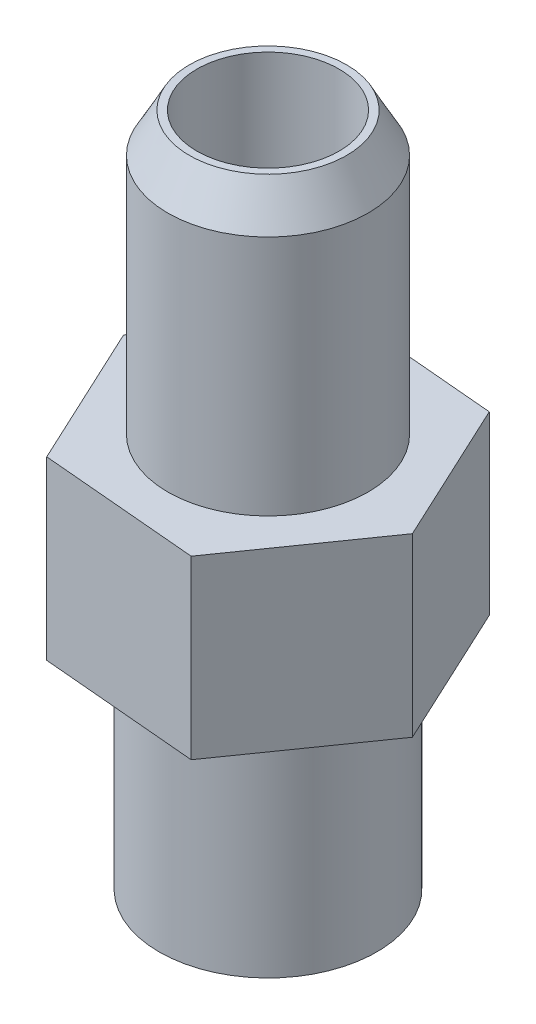
ISO-10303-21;
HEADER;
FILE_DESCRIPTION(('STEP AP214'),'2;1');
FILE_NAME('part.step','',(''),(''),'','','');
FILE_SCHEMA(('AUTOMOTIVE_DESIGN { 1 0 10303 214 1 1 1 1 }'));
ENDSEC;
DATA;
#1=APPLICATION_CONTEXT('core data for automotive mechanical design processes');
#2=APPLICATION_PROTOCOL_DEFINITION('international standard','automotive_design',2000,#1);
#3=PRODUCT_CONTEXT('',#1,'mechanical');
#4=PRODUCT('Part','Part','',(#3));
#5=PRODUCT_RELATED_PRODUCT_CATEGORY('part','',(#4));
#6=PRODUCT_DEFINITION_FORMATION('','',#4);
#7=PRODUCT_DEFINITION_CONTEXT('part definition',#1,'design');
#8=PRODUCT_DEFINITION('design','',#6,#7);
#9=PRODUCT_DEFINITION_SHAPE('','',#8);
#10=(LENGTH_UNIT() NAMED_UNIT(*) SI_UNIT(.MILLI.,.METRE.));
#11=(NAMED_UNIT(*) PLANE_ANGLE_UNIT() SI_UNIT($,.RADIAN.));
#12=(NAMED_UNIT(*) SI_UNIT($,.STERADIAN.) SOLID_ANGLE_UNIT());
#13=UNCERTAINTY_MEASURE_WITH_UNIT(LENGTH_MEASURE(1.E-05),#10,'distance_accuracy_value','');
#14=(GEOMETRIC_REPRESENTATION_CONTEXT(3) GLOBAL_UNCERTAINTY_ASSIGNED_CONTEXT((#13)) GLOBAL_UNIT_ASSIGNED_CONTEXT((#10,
#11,#12)) REPRESENTATION_CONTEXT('',''));
#15=CARTESIAN_POINT('',(0.,0.,0.));
#16=DIRECTION('',(0.,0.,1.));
#17=DIRECTION('',(1.,0.,0.));
#18=AXIS2_PLACEMENT_3D('',#15,#16,#17);
#19=CARTESIAN_POINT('',(6.3,18.1,0.));
#20=DIRECTION('',(0.,1.,0.));
#21=DIRECTION('',(0.,0.,1.));
#22=AXIS2_PLACEMENT_3D('',#19,#20,#21);
#23=PLANE('',#22);
#24=CARTESIAN_POINT('',(0.,18.1,0.));
#25=DIRECTION('',(0.,-1.,0.));
#26=DIRECTION('',(0.,0.,-1.));
#27=AXIS2_PLACEMENT_3D('',#24,#25,#26);
#28=CIRCLE('',#27,4.6);
#29=CARTESIAN_POINT('',(0.,18.1,-4.6));
#30=VERTEX_POINT('',#29);
#31=EDGE_CURVE('E142',#30,#30,#28,.T.);
#32=ORIENTED_EDGE('',*,*,#31,.T.);
#33=EDGE_LOOP('',(#32));
#34=FACE_BOUND('',#33,.T.);
#35=DIRECTION('',(0.573623240162906,0.,-0.819119269914345));
#36=VECTOR('',#35,1.);
#37=CARTESIAN_POINT('',(3.084448550397,18.1,6.61560813154883));
#38=LINE('',#37,#36);
#39=CARTESIAN_POINT('',(3.084448550397,18.1,6.61560813154883));
#40=VERTEX_POINT('',#39);
#41=CARTESIAN_POINT('',(7.27150897860269,18.1,0.63659326446452));
#42=VERTEX_POINT('',#41);
#43=EDGE_CURVE('E111',#40,#42,#38,.T.);
#44=ORIENTED_EDGE('',*,*,#43,.T.);
#45=DIRECTION('',(-0.422566476393732,0.,-0.906331933139391));
#46=VECTOR('',#45,1.);
#47=CARTESIAN_POINT('',(7.27150897860269,18.1,0.63659326446452));
#48=LINE('',#47,#46);
#49=CARTESIAN_POINT('',(4.18706042820569,18.1,-5.97901486708431));
#50=VERTEX_POINT('',#49);
#51=EDGE_CURVE('E99',#42,#50,#48,.T.);
#52=ORIENTED_EDGE('',*,*,#51,.T.);
#53=DIRECTION('',(-0.996189716556638,0.,-0.0872126632250464));
#54=VECTOR('',#53,1.);
#55=CARTESIAN_POINT('',(4.18706042820569,18.1,-5.97901486708431));
#56=LINE('',#55,#54);
#57=CARTESIAN_POINT('',(-3.084448550397,18.1,-6.61560813154883));
#58=VERTEX_POINT('',#57);
#59=EDGE_CURVE('E104',#50,#58,#56,.T.);
#60=ORIENTED_EDGE('',*,*,#59,.T.);
#61=DIRECTION('',(-0.573623240162906,0.,0.819119269914345));
#62=VECTOR('',#61,1.);
#63=CARTESIAN_POINT('',(-3.084448550397,18.1,-6.61560813154883));
#64=LINE('',#63,#62);
#65=CARTESIAN_POINT('',(-7.27150897860269,18.1,-0.636593264464522));
#66=VERTEX_POINT('',#65);
#67=EDGE_CURVE('E108',#58,#66,#64,.T.);
#68=ORIENTED_EDGE('',*,*,#67,.T.);
#69=DIRECTION('',(0.422566476393732,0.,0.906331933139391));
#70=VECTOR('',#69,1.);
#71=CARTESIAN_POINT('',(-7.27150897860269,18.1,-0.636593264464522));
#72=LINE('',#71,#70);
#73=CARTESIAN_POINT('',(-4.18706042820569,18.1,5.97901486708431));
#74=VERTEX_POINT('',#73);
#75=EDGE_CURVE('E166',#66,#74,#72,.T.);
#76=ORIENTED_EDGE('',*,*,#75,.T.);
#77=DIRECTION('',(0.996189716556638,0.,0.0872126632250462));
#78=VECTOR('',#77,1.);
#79=CARTESIAN_POINT('',(-4.18706042820569,18.1,5.97901486708431));
#80=LINE('',#79,#78);
#81=EDGE_CURVE('E117',#74,#40,#80,.T.);
#82=ORIENTED_EDGE('',*,*,#81,.T.);
#83=EDGE_LOOP('',(#44,#52,#60,#68,#76,#82));
#84=FACE_BOUND('',#83,.T.);
#85=ADVANCED_FACE('F34',(#34,#84),#23,.T.);
#86=CARTESIAN_POINT('',(0.,0.,0.));
#87=DIRECTION('',(0.,-1.,0.));
#88=DIRECTION('',(0.,0.,-1.));
#89=AXIS2_PLACEMENT_3D('',#86,#87,#88);
#90=CYLINDRICAL_SURFACE('',#89,4.6);
#91=CARTESIAN_POINT('',(0.,29.2,0.));
#92=DIRECTION('',(0.,-1.,0.));
#93=DIRECTION('',(0.,0.,-1.));
#94=AXIS2_PLACEMENT_3D('',#91,#92,#93);
#95=CIRCLE('',#94,4.6);
#96=CARTESIAN_POINT('',(0.,29.2,-4.6));
#97=VERTEX_POINT('',#96);
#98=EDGE_CURVE('E139',#97,#97,#95,.T.);
#99=ORIENTED_EDGE('',*,*,#98,.T.);
#100=EDGE_LOOP('',(#99));
#101=FACE_BOUND('',#100,.T.);
#102=ORIENTED_EDGE('',*,*,#31,.F.);
#103=EDGE_LOOP('',(#102));
#104=FACE_BOUND('',#103,.T.);
#105=ADVANCED_FACE('F187',(#101,#104),#90,.T.);
#106=CARTESIAN_POINT('',(0.,29.2,0.));
#107=DIRECTION('',(0.,-1.,0.));
#108=DIRECTION('',(0.,0.,-1.));
#109=AXIS2_PLACEMENT_3D('',#106,#107,#108);
#110=CONICAL_SURFACE('',#109,4.6,0.502341921510061);
#111=CARTESIAN_POINT('',(0.,31.,0.));
#112=DIRECTION('',(0.,-1.,0.));
#113=DIRECTION('',(0.,0.,-1.));
#114=AXIS2_PLACEMENT_3D('',#111,#112,#113);
#115=CIRCLE('',#114,3.61117494919417);
#116=CARTESIAN_POINT('',(0.,31.,-3.61117494919417));
#117=VERTEX_POINT('',#116);
#118=EDGE_CURVE('E136',#117,#117,#115,.T.);
#119=ORIENTED_EDGE('',*,*,#118,.T.);
#120=EDGE_LOOP('',(#119));
#121=FACE_BOUND('',#120,.T.);
#122=ORIENTED_EDGE('',*,*,#98,.F.);
#123=EDGE_LOOP('',(#122));
#124=FACE_BOUND('',#123,.T.);
#125=ADVANCED_FACE('F193',(#121,#124),#110,.T.);
#126=CARTESIAN_POINT('',(3.61117494919417,31.,0.));
#127=DIRECTION('',(0.,1.,0.));
#128=DIRECTION('',(0.,0.,1.));
#129=AXIS2_PLACEMENT_3D('',#126,#127,#128);
#130=PLANE('',#129);
#131=CARTESIAN_POINT('',(0.,31.,0.));
#132=DIRECTION('',(0.,1.,0.));
#133=DIRECTION('',(0.,0.,1.));
#134=AXIS2_PLACEMENT_3D('',#131,#132,#133);
#135=CIRCLE('',#134,3.26860596304638);
#136=CARTESIAN_POINT('',(0.,31.,3.26860596304638));
#137=VERTEX_POINT('',#136);
#138=EDGE_CURVE('E172',#137,#137,#135,.T.);
#139=ORIENTED_EDGE('',*,*,#138,.F.);
#140=EDGE_LOOP('',(#139));
#141=FACE_BOUND('',#140,.T.);
#142=ORIENTED_EDGE('',*,*,#118,.F.);
#143=EDGE_LOOP('',(#142));
#144=FACE_BOUND('',#143,.T.);
#145=ADVANCED_FACE('F199',(#141,#144),#130,.T.);
#146=CARTESIAN_POINT('',(7.27150897860269,-9.66124246085323,0.63659326446452));
#147=DIRECTION('',(0.906331933139391,0.,-0.422566476393732));
#148=DIRECTION('',(-0.422566476393732,0.,-0.906331933139391));
#149=AXIS2_PLACEMENT_3D('',#146,#147,#148);
#150=PLANE('',#149);
#151=DIRECTION('',(0.,1.,0.));
#152=VECTOR('',#151,1.);
#153=CARTESIAN_POINT('',(7.27150897860269,-9.66124246085323,0.63659326446452));
#154=LINE('',#153,#152);
#155=CARTESIAN_POINT('',(7.27150897860269,10.,0.63659326446452));
#156=VERTEX_POINT('',#155);
#157=EDGE_CURVE('E52',#156,#42,#154,.T.);
#158=ORIENTED_EDGE('',*,*,#157,.F.);
#159=DIRECTION('',(-0.422566476393732,0.,-0.906331933139391));
#160=VECTOR('',#159,1.);
#161=CARTESIAN_POINT('',(7.27150897860269,10.,0.63659326446452));
#162=LINE('',#161,#160);
#163=CARTESIAN_POINT('',(4.18706042820569,10.,-5.97901486708431));
#164=VERTEX_POINT('',#163);
#165=EDGE_CURVE('E101',#156,#164,#162,.T.);
#166=ORIENTED_EDGE('',*,*,#165,.T.);
#167=DIRECTION('',(0.,1.,0.));
#168=VECTOR('',#167,1.);
#169=CARTESIAN_POINT('',(4.18706042820569,-9.66124246085323,-5.97901486708431));
#170=LINE('',#169,#168);
#171=EDGE_CURVE('E96',#164,#50,#170,.T.);
#172=ORIENTED_EDGE('',*,*,#171,.T.);
#173=ORIENTED_EDGE('',*,*,#51,.F.);
#174=EDGE_LOOP('',(#158,#166,#172,#173));
#175=FACE_BOUND('',#174,.T.);
#176=ADVANCED_FACE('F97',(#175),#150,.T.);
#177=CARTESIAN_POINT('',(4.18706042820569,-9.66124246085323,-5.97901486708431));
#178=DIRECTION('',(0.0872126632250464,0.,-0.996189716556638));
#179=DIRECTION('',(-0.996189716556638,0.,-0.0872126632250464));
#180=AXIS2_PLACEMENT_3D('',#177,#178,#179);
#181=PLANE('',#180);
#182=ORIENTED_EDGE('',*,*,#171,.F.);
#183=DIRECTION('',(-0.996189716556638,0.,-0.0872126632250464));
#184=VECTOR('',#183,1.);
#185=CARTESIAN_POINT('',(4.18706042820569,10.,-5.97901486708431));
#186=LINE('',#185,#184);
#187=CARTESIAN_POINT('',(-3.084448550397,10.,-6.61560813154883));
#188=VERTEX_POINT('',#187);
#189=EDGE_CURVE('E80',#164,#188,#186,.T.);
#190=ORIENTED_EDGE('',*,*,#189,.T.);
#191=DIRECTION('',(0.,1.,0.));
#192=VECTOR('',#191,1.);
#193=CARTESIAN_POINT('',(-3.084448550397,-9.66124246085323,-6.61560813154883));
#194=LINE('',#193,#192);
#195=EDGE_CURVE('E91',#188,#58,#194,.T.);
#196=ORIENTED_EDGE('',*,*,#195,.T.);
#197=ORIENTED_EDGE('',*,*,#59,.F.);
#198=EDGE_LOOP('',(#182,#190,#196,#197));
#199=FACE_BOUND('',#198,.T.);
#200=ADVANCED_FACE('F105',(#199),#181,.T.);
#201=CARTESIAN_POINT('',(-3.084448550397,-9.66124246085323,-6.61560813154883));
#202=DIRECTION('',(-0.819119269914345,0.,-0.573623240162906));
#203=DIRECTION('',(-0.573623240162906,0.,0.819119269914345));
#204=AXIS2_PLACEMENT_3D('',#201,#202,#203);
#205=PLANE('',#204);
#206=ORIENTED_EDGE('',*,*,#195,.F.);
#207=DIRECTION('',(-0.573623240162906,0.,0.819119269914345));
#208=VECTOR('',#207,1.);
#209=CARTESIAN_POINT('',(-3.084448550397,10.,-6.61560813154883));
#210=LINE('',#209,#208);
#211=CARTESIAN_POINT('',(-7.27150897860269,10.,-0.636593264464523));
#212=VERTEX_POINT('',#211);
#213=EDGE_CURVE('E75',#188,#212,#210,.T.);
#214=ORIENTED_EDGE('',*,*,#213,.T.);
#215=DIRECTION('',(0.,1.,0.));
#216=VECTOR('',#215,1.);
#217=CARTESIAN_POINT('',(-7.27150897860269,-9.66124246085323,-0.636593264464522));
#218=LINE('',#217,#216);
#219=EDGE_CURVE('E128',#212,#66,#218,.T.);
#220=ORIENTED_EDGE('',*,*,#219,.T.);
#221=ORIENTED_EDGE('',*,*,#67,.F.);
#222=EDGE_LOOP('',(#206,#214,#220,#221));
#223=FACE_BOUND('',#222,.T.);
#224=ADVANCED_FACE('F168',(#223),#205,.T.);
#225=CARTESIAN_POINT('',(-7.27150897860269,-9.66124246085323,-0.636593264464522));
#226=DIRECTION('',(-0.906331933139391,0.,0.422566476393732));
#227=DIRECTION('',(0.422566476393732,0.,0.906331933139391));
#228=AXIS2_PLACEMENT_3D('',#225,#226,#227);
#229=PLANE('',#228);
#230=ORIENTED_EDGE('',*,*,#219,.F.);
#231=DIRECTION('',(0.422566476393732,0.,0.906331933139391));
#232=VECTOR('',#231,1.);
#233=CARTESIAN_POINT('',(-7.27150897860269,10.,-0.636593264464522));
#234=LINE('',#233,#232);
#235=CARTESIAN_POINT('',(-4.18706042820569,10.,5.97901486708431));
#236=VERTEX_POINT('',#235);
#237=EDGE_CURVE('E125',#212,#236,#234,.T.);
#238=ORIENTED_EDGE('',*,*,#237,.T.);
#239=DIRECTION('',(0.,1.,0.));
#240=VECTOR('',#239,1.);
#241=CARTESIAN_POINT('',(-4.18706042820569,-9.66124246085323,5.97901486708431));
#242=LINE('',#241,#240);
#243=EDGE_CURVE('E124',#236,#74,#242,.T.);
#244=ORIENTED_EDGE('',*,*,#243,.T.);
#245=ORIENTED_EDGE('',*,*,#75,.F.);
#246=EDGE_LOOP('',(#230,#238,#244,#245));
#247=FACE_BOUND('',#246,.T.);
#248=ADVANCED_FACE('F165',(#247),#229,.T.);
#249=CARTESIAN_POINT('',(-4.18706042820569,-9.66124246085323,5.97901486708431));
#250=DIRECTION('',(-0.0872126632250462,0.,0.996189716556638));
#251=DIRECTION('',(0.996189716556638,0.,0.0872126632250462));
#252=AXIS2_PLACEMENT_3D('',#249,#250,#251);
#253=PLANE('',#252);
#254=ORIENTED_EDGE('',*,*,#243,.F.);
#255=DIRECTION('',(0.996189716556638,0.,0.0872126632250462));
#256=VECTOR('',#255,1.);
#257=CARTESIAN_POINT('',(-4.18706042820569,10.,5.97901486708431));
#258=LINE('',#257,#256);
#259=CARTESIAN_POINT('',(3.084448550397,10.,6.61560813154883));
#260=VERTEX_POINT('',#259);
#261=EDGE_CURVE('E121',#236,#260,#258,.T.);
#262=ORIENTED_EDGE('',*,*,#261,.T.);
#263=DIRECTION('',(0.,1.,0.));
#264=VECTOR('',#263,1.);
#265=CARTESIAN_POINT('',(3.084448550397,-9.66124246085323,6.61560813154883));
#266=LINE('',#265,#264);
#267=EDGE_CURVE('E120',#260,#40,#266,.T.);
#268=ORIENTED_EDGE('',*,*,#267,.T.);
#269=ORIENTED_EDGE('',*,*,#81,.F.);
#270=EDGE_LOOP('',(#254,#262,#268,#269));
#271=FACE_BOUND('',#270,.T.);
#272=ADVANCED_FACE('F160',(#271),#253,.T.);
#273=CARTESIAN_POINT('',(3.084448550397,-9.66124246085323,6.61560813154883));
#274=DIRECTION('',(0.819119269914345,0.,0.573623240162906));
#275=DIRECTION('',(0.573623240162906,0.,-0.819119269914345));
#276=AXIS2_PLACEMENT_3D('',#273,#274,#275);
#277=PLANE('',#276);
#278=ORIENTED_EDGE('',*,*,#267,.F.);
#279=DIRECTION('',(0.573623240162906,0.,-0.819119269914345));
#280=VECTOR('',#279,1.);
#281=CARTESIAN_POINT('',(3.084448550397,10.,6.61560813154883));
#282=LINE('',#281,#280);
#283=EDGE_CURVE('E118',#260,#156,#282,.T.);
#284=ORIENTED_EDGE('',*,*,#283,.T.);
#285=ORIENTED_EDGE('',*,*,#157,.T.);
#286=ORIENTED_EDGE('',*,*,#43,.F.);
#287=EDGE_LOOP('',(#278,#284,#285,#286));
#288=FACE_BOUND('',#287,.T.);
#289=ADVANCED_FACE('F157',(#288),#277,.T.);
#290=CARTESIAN_POINT('',(0.,0.,0.));
#291=DIRECTION('',(0.,-1.,0.));
#292=DIRECTION('',(0.,0.,-1.));
#293=AXIS2_PLACEMENT_3D('',#290,#291,#292);
#294=PLANE('',#293);
#295=CARTESIAN_POINT('',(0.,0.,0.));
#296=DIRECTION('',(0.,-1.,0.));
#297=DIRECTION('',(0.,0.,-1.));
#298=AXIS2_PLACEMENT_3D('',#295,#296,#297);
#299=CIRCLE('',#298,3.26860596304638);
#300=CARTESIAN_POINT('',(0.,0.,-3.26860596304638));
#301=VERTEX_POINT('',#300);
#302=EDGE_CURVE('E38',#301,#301,#299,.T.);
#303=ORIENTED_EDGE('',*,*,#302,.F.);
#304=EDGE_LOOP('',(#303));
#305=FACE_BOUND('',#304,.T.);
#306=CARTESIAN_POINT('',(0.,0.,0.));
#307=DIRECTION('',(0.,-1.,0.));
#308=DIRECTION('',(0.,0.,-1.));
#309=AXIS2_PLACEMENT_3D('',#306,#307,#308);
#310=CIRCLE('',#309,5.);
#311=CARTESIAN_POINT('',(0.,0.,-5.));
#312=VERTEX_POINT('',#311);
#313=EDGE_CURVE('E11',#312,#312,#310,.T.);
#314=ORIENTED_EDGE('',*,*,#313,.T.);
#315=EDGE_LOOP('',(#314));
#316=FACE_BOUND('',#315,.T.);
#317=ADVANCED_FACE('F36',(#305,#316),#294,.T.);
#318=CARTESIAN_POINT('',(0.,0.,0.));
#319=DIRECTION('',(0.,-1.,0.));
#320=DIRECTION('',(0.,0.,-1.));
#321=AXIS2_PLACEMENT_3D('',#318,#319,#320);
#322=CYLINDRICAL_SURFACE('',#321,5.);
#323=CARTESIAN_POINT('',(0.,10.,0.));
#324=DIRECTION('',(0.,-1.,0.));
#325=DIRECTION('',(0.,0.,-1.));
#326=AXIS2_PLACEMENT_3D('',#323,#324,#325);
#327=CIRCLE('',#326,5.);
#328=CARTESIAN_POINT('',(0.,10.,-5.));
#329=VERTEX_POINT('',#328);
#330=EDGE_CURVE('E44',#329,#329,#327,.T.);
#331=ORIENTED_EDGE('',*,*,#330,.T.);
#332=EDGE_LOOP('',(#331));
#333=FACE_BOUND('',#332,.T.);
#334=ORIENTED_EDGE('',*,*,#313,.F.);
#335=EDGE_LOOP('',(#334));
#336=FACE_BOUND('',#335,.T.);
#337=ADVANCED_FACE('F148',(#333,#336),#322,.T.);
#338=CARTESIAN_POINT('',(5.,10.,0.));
#339=DIRECTION('',(0.,-1.,0.));
#340=DIRECTION('',(0.,0.,-1.));
#341=AXIS2_PLACEMENT_3D('',#338,#339,#340);
#342=PLANE('',#341);
#343=ORIENTED_EDGE('',*,*,#330,.F.);
#344=EDGE_LOOP('',(#343));
#345=FACE_BOUND('',#344,.T.);
#346=ORIENTED_EDGE('',*,*,#283,.F.);
#347=ORIENTED_EDGE('',*,*,#261,.F.);
#348=ORIENTED_EDGE('',*,*,#237,.F.);
#349=ORIENTED_EDGE('',*,*,#213,.F.);
#350=ORIENTED_EDGE('',*,*,#189,.F.);
#351=ORIENTED_EDGE('',*,*,#165,.F.);
#352=EDGE_LOOP('',(#346,#347,#348,#349,#350,#351));
#353=FACE_BOUND('',#352,.T.);
#354=ADVANCED_FACE('F151',(#345,#353),#342,.T.);
#355=CARTESIAN_POINT('',(0.,-9.00000000000001,0.));
#356=DIRECTION('',(0.,1.,0.));
#357=DIRECTION('',(0.,0.,1.));
#358=AXIS2_PLACEMENT_3D('',#355,#356,#357);
#359=CYLINDRICAL_SURFACE('',#358,3.26860596304638);
#360=ORIENTED_EDGE('',*,*,#302,.T.);
#361=EDGE_LOOP('',(#360));
#362=FACE_BOUND('',#361,.T.);
#363=ORIENTED_EDGE('',*,*,#138,.T.);
#364=EDGE_LOOP('',(#363));
#365=FACE_BOUND('',#364,.T.);
#366=ADVANCED_FACE('F153',(#362,#365),#359,.F.);
#367=CLOSED_SHELL('',(#85,#105,#125,#145,#176,#200,#224,#248,#272,#289,#317,#337,#354,#366));
#368=MANIFOLD_SOLID_BREP('B2',#367);
#369=ADVANCED_BREP_SHAPE_REPRESENTATION('',(#18,#368),#14);
#370=SHAPE_DEFINITION_REPRESENTATION(#9,#369);
ENDSEC;
END-ISO-10303-21;
